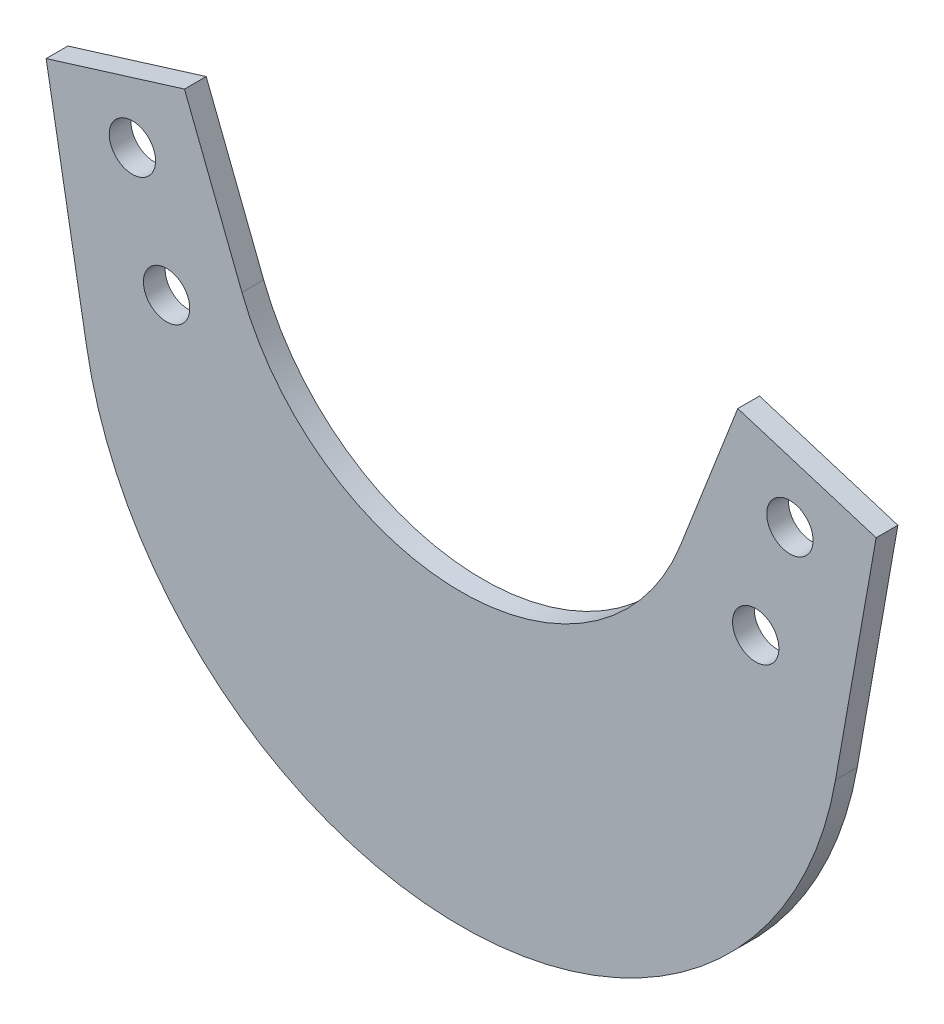
ISO-10303-21;
HEADER;
FILE_DESCRIPTION(('STEP AP214'),'2;1');
FILE_NAME('part.step','',(''),(''),'','','');
FILE_SCHEMA(('AUTOMOTIVE_DESIGN { 1 0 10303 214 1 1 1 1 }'));
ENDSEC;
DATA;
#1=APPLICATION_CONTEXT('core data for automotive mechanical design processes');
#2=APPLICATION_PROTOCOL_DEFINITION('international standard','automotive_design',2000,#1);
#3=PRODUCT_CONTEXT('',#1,'mechanical');
#4=PRODUCT('Part','Part','',(#3));
#5=PRODUCT_RELATED_PRODUCT_CATEGORY('part','',(#4));
#6=PRODUCT_DEFINITION_FORMATION('','',#4);
#7=PRODUCT_DEFINITION_CONTEXT('part definition',#1,'design');
#8=PRODUCT_DEFINITION('design','',#6,#7);
#9=PRODUCT_DEFINITION_SHAPE('','',#8);
#10=(LENGTH_UNIT() NAMED_UNIT(*) SI_UNIT(.MILLI.,.METRE.));
#11=(NAMED_UNIT(*) PLANE_ANGLE_UNIT() SI_UNIT($,.RADIAN.));
#12=(NAMED_UNIT(*) SI_UNIT($,.STERADIAN.) SOLID_ANGLE_UNIT());
#13=UNCERTAINTY_MEASURE_WITH_UNIT(LENGTH_MEASURE(1.E-05),#10,'distance_accuracy_value','');
#14=(GEOMETRIC_REPRESENTATION_CONTEXT(3) GLOBAL_UNCERTAINTY_ASSIGNED_CONTEXT((#13)) GLOBAL_UNIT_ASSIGNED_CONTEXT((#10,
#11,#12)) REPRESENTATION_CONTEXT('',''));
#15=CARTESIAN_POINT('',(0.,0.,0.));
#16=DIRECTION('',(0.,0.,1.));
#17=DIRECTION('',(1.,0.,0.));
#18=AXIS2_PLACEMENT_3D('',#15,#16,#17);
#19=CARTESIAN_POINT('',(0.,-9.98934813051989,1.5));
#20=DIRECTION('',(0.,0.,-1.));
#21=DIRECTION('',(-1.,0.,0.));
#22=AXIS2_PLACEMENT_3D('',#19,#20,#21);
#23=PLANE('',#22);
#24=CARTESIAN_POINT('',(-20.3447741328273,-8.66515844111932,1.5));
#25=DIRECTION('',(0.,0.,1.));
#26=DIRECTION('',(-1.,0.,0.));
#27=AXIS2_PLACEMENT_3D('',#24,#25,#26);
#28=CIRCLE('',#27,1.6);
#29=CARTESIAN_POINT('',(-21.9447741328273,-8.66515844111932,1.5));
#30=VERTEX_POINT('',#29);
#31=EDGE_CURVE('E194',#30,#30,#28,.T.);
#32=ORIENTED_EDGE('',*,*,#31,.F.);
#33=EDGE_LOOP('',(#32));
#34=FACE_BOUND('',#33,.T.);
#35=CARTESIAN_POINT('',(22.7056354362289,-1.02144639093708,1.5));
#36=DIRECTION('',(0.,0.,1.));
#37=DIRECTION('',(1.,0.,0.));
#38=AXIS2_PLACEMENT_3D('',#35,#36,#37);
#39=CIRCLE('',#38,1.6);
#40=CARTESIAN_POINT('',(24.3056354362289,-1.02144639093708,1.5));
#41=VERTEX_POINT('',#40);
#42=EDGE_CURVE('E140',#41,#41,#39,.T.);
#43=ORIENTED_EDGE('',*,*,#42,.F.);
#44=EDGE_LOOP('',(#43));
#45=FACE_BOUND('',#44,.T.);
#46=CARTESIAN_POINT('',(0.,-9.98934813051989,1.5));
#47=DIRECTION('',(0.,0.,1.));
#48=DIRECTION('',(-1.,0.,0.));
#49=AXIS2_PLACEMENT_3D('',#46,#47,#48);
#50=CIRCLE('',#49,26.2596890801031);
#51=CARTESIAN_POINT('',(-25.8597429300659,-14.5549769124724,1.5));
#52=VERTEX_POINT('',#51);
#53=CARTESIAN_POINT('',(25.8597429300659,-14.5549769124724,1.5));
#54=VERTEX_POINT('',#53);
#55=EDGE_CURVE('E151',#52,#54,#50,.T.);
#56=ORIENTED_EDGE('',*,*,#55,.T.);
#57=DIRECTION('',(0.173864540742482,0.984769577856874,0.));
#58=VECTOR('',#57,1.);
#59=CARTESIAN_POINT('',(25.8597429300659,-14.5549769124724,1.5));
#60=LINE('',#59,#58);
#61=CARTESIAN_POINT('',(28.6633861192936,1.32487131952806,1.5));
#62=VERTEX_POINT('',#61);
#63=EDGE_CURVE('E99',#54,#62,#60,.T.);
#64=ORIENTED_EDGE('',*,*,#63,.T.);
#65=DIRECTION('',(-0.955464006272779,0.295107662925195,0.));
#66=VECTOR('',#65,1.);
#67=CARTESIAN_POINT('',(19.1087460565658,4.27594794878001,1.5));
#68=LINE('',#67,#66);
#69=CARTESIAN_POINT('',(19.1087460565658,4.27594794878001,1.5));
#70=VERTEX_POINT('',#69);
#71=EDGE_CURVE('E166',#62,#70,#68,.T.);
#72=ORIENTED_EDGE('',*,*,#71,.T.);
#73=DIRECTION('',(-0.363351040746457,-0.931652307026858,0.));
#74=VECTOR('',#73,1.);
#75=CARTESIAN_POINT('',(19.1087460565658,4.27594794878001,1.5));
#76=LINE('',#75,#74);
#77=CARTESIAN_POINT('',(15.1384530042422,-5.90410458160777,1.5));
#78=VERTEX_POINT('',#77);
#79=EDGE_CURVE('E179',#70,#78,#76,.T.);
#80=ORIENTED_EDGE('',*,*,#79,.T.);
#81=CARTESIAN_POINT('',(0.,0.,1.5));
#82=DIRECTION('',(0.,0.,-1.));
#83=DIRECTION('',(-1.,0.,0.));
#84=AXIS2_PLACEMENT_3D('',#81,#82,#83);
#85=CIRCLE('',#84,16.249037210623);
#86=CARTESIAN_POINT('',(-15.1384530042422,-5.90410458160778,1.5));
#87=VERTEX_POINT('',#86);
#88=EDGE_CURVE('E118',#78,#87,#85,.T.);
#89=ORIENTED_EDGE('',*,*,#88,.T.);
#90=DIRECTION('',(-0.363351040746457,0.931652307026858,0.));
#91=VECTOR('',#90,1.);
#92=CARTESIAN_POINT('',(-19.1087460565658,4.27594794878001,1.5));
#93=LINE('',#92,#91);
#94=CARTESIAN_POINT('',(-19.1087460565658,4.27594794878001,1.5));
#95=VERTEX_POINT('',#94);
#96=EDGE_CURVE('E112',#87,#95,#93,.T.);
#97=ORIENTED_EDGE('',*,*,#96,.T.);
#98=DIRECTION('',(-0.955464006272779,-0.295107662925195,0.));
#99=VECTOR('',#98,1.);
#100=CARTESIAN_POINT('',(-19.1087460565658,4.27594794878001,1.5));
#101=LINE('',#100,#99);
#102=CARTESIAN_POINT('',(-28.6633861192936,1.32487131952806,1.5));
#103=VERTEX_POINT('',#102);
#104=EDGE_CURVE('E116',#95,#103,#101,.T.);
#105=ORIENTED_EDGE('',*,*,#104,.T.);
#106=DIRECTION('',(0.173864540742482,-0.984769577856874,0.));
#107=VECTOR('',#106,1.);
#108=CARTESIAN_POINT('',(-25.8597429300659,-14.5549769124724,1.5));
#109=LINE('',#108,#107);
#110=EDGE_CURVE('E56',#103,#52,#109,.T.);
#111=ORIENTED_EDGE('',*,*,#110,.T.);
#112=EDGE_LOOP('',(#56,#64,#72,#80,#89,#97,#105,#111));
#113=FACE_BOUND('',#112,.T.);
#114=CARTESIAN_POINT('',(20.3447741328273,-8.66515844111932,1.5));
#115=DIRECTION('',(0.,0.,1.));
#116=DIRECTION('',(1.,0.,0.));
#117=AXIS2_PLACEMENT_3D('',#114,#115,#116);
#118=CIRCLE('',#117,1.6);
#119=CARTESIAN_POINT('',(21.9447741328274,-8.66515844111932,1.5));
#120=VERTEX_POINT('',#119);
#121=EDGE_CURVE('E188',#120,#120,#118,.T.);
#122=ORIENTED_EDGE('',*,*,#121,.F.);
#123=EDGE_LOOP('',(#122));
#124=FACE_BOUND('',#123,.T.);
#125=CARTESIAN_POINT('',(-22.7056354362289,-1.02144639093708,1.5));
#126=DIRECTION('',(0.,0.,1.));
#127=DIRECTION('',(-1.,0.,0.));
#128=AXIS2_PLACEMENT_3D('',#125,#126,#127);
#129=CIRCLE('',#128,1.59999999999999);
#130=CARTESIAN_POINT('',(-24.3056354362289,-1.02144639093708,1.5));
#131=VERTEX_POINT('',#130);
#132=EDGE_CURVE('E200',#131,#131,#129,.T.);
#133=ORIENTED_EDGE('',*,*,#132,.F.);
#134=EDGE_LOOP('',(#133));
#135=FACE_BOUND('',#134,.T.);
#136=ADVANCED_FACE('F39',(#34,#45,#113,#124,#135),#23,.F.);
#137=CARTESIAN_POINT('',(0.,-9.98934813051989,0.));
#138=DIRECTION('',(0.,0.,-1.));
#139=DIRECTION('',(-1.,0.,0.));
#140=AXIS2_PLACEMENT_3D('',#137,#138,#139);
#141=PLANE('',#140);
#142=CARTESIAN_POINT('',(-20.3447741328273,-8.66515844111932,0.));
#143=DIRECTION('',(0.,0.,1.));
#144=DIRECTION('',(-1.,0.,0.));
#145=AXIS2_PLACEMENT_3D('',#142,#143,#144);
#146=CIRCLE('',#145,1.6);
#147=CARTESIAN_POINT('',(-21.9447741328273,-8.66515844111932,0.));
#148=VERTEX_POINT('',#147);
#149=EDGE_CURVE('E197',#148,#148,#146,.T.);
#150=ORIENTED_EDGE('',*,*,#149,.T.);
#151=EDGE_LOOP('',(#150));
#152=FACE_BOUND('',#151,.T.);
#153=CARTESIAN_POINT('',(22.7056354362289,-1.02144639093708,0.));
#154=DIRECTION('',(0.,0.,1.));
#155=DIRECTION('',(1.,0.,0.));
#156=AXIS2_PLACEMENT_3D('',#153,#154,#155);
#157=CIRCLE('',#156,1.6);
#158=CARTESIAN_POINT('',(24.3056354362289,-1.02144639093708,0.));
#159=VERTEX_POINT('',#158);
#160=EDGE_CURVE('E185',#159,#159,#157,.T.);
#161=ORIENTED_EDGE('',*,*,#160,.T.);
#162=EDGE_LOOP('',(#161));
#163=FACE_BOUND('',#162,.T.);
#164=CARTESIAN_POINT('',(0.,-9.98934813051989,0.));
#165=DIRECTION('',(0.,0.,1.));
#166=DIRECTION('',(-1.,0.,0.));
#167=AXIS2_PLACEMENT_3D('',#164,#165,#166);
#168=CIRCLE('',#167,26.2596890801031);
#169=CARTESIAN_POINT('',(-25.8597429300659,-14.5549769124724,0.));
#170=VERTEX_POINT('',#169);
#171=CARTESIAN_POINT('',(25.8597429300659,-14.5549769124724,0.));
#172=VERTEX_POINT('',#171);
#173=EDGE_CURVE('E136',#170,#172,#168,.T.);
#174=ORIENTED_EDGE('',*,*,#173,.F.);
#175=DIRECTION('',(0.173864540742482,-0.984769577856874,0.));
#176=VECTOR('',#175,1.);
#177=CARTESIAN_POINT('',(-25.8597429300659,-14.5549769124724,0.));
#178=LINE('',#177,#176);
#179=CARTESIAN_POINT('',(-28.6633861192936,1.32487131952806,0.));
#180=VERTEX_POINT('',#179);
#181=EDGE_CURVE('E91',#180,#170,#178,.T.);
#182=ORIENTED_EDGE('',*,*,#181,.F.);
#183=DIRECTION('',(-0.955464006272779,-0.295107662925195,0.));
#184=VECTOR('',#183,1.);
#185=CARTESIAN_POINT('',(-19.1087460565658,4.27594794878001,0.));
#186=LINE('',#185,#184);
#187=CARTESIAN_POINT('',(-19.1087460565658,4.27594794878001,0.));
#188=VERTEX_POINT('',#187);
#189=EDGE_CURVE('E85',#188,#180,#186,.T.);
#190=ORIENTED_EDGE('',*,*,#189,.F.);
#191=DIRECTION('',(-0.363351040746457,0.931652307026858,0.));
#192=VECTOR('',#191,1.);
#193=CARTESIAN_POINT('',(-19.1087460565658,4.27594794878001,0.));
#194=LINE('',#193,#192);
#195=CARTESIAN_POINT('',(-15.1384530042422,-5.90410458160778,0.));
#196=VERTEX_POINT('',#195);
#197=EDGE_CURVE('E126',#196,#188,#194,.T.);
#198=ORIENTED_EDGE('',*,*,#197,.F.);
#199=CARTESIAN_POINT('',(0.,0.,0.));
#200=DIRECTION('',(0.,0.,-1.));
#201=DIRECTION('',(-1.,0.,0.));
#202=AXIS2_PLACEMENT_3D('',#199,#200,#201);
#203=CIRCLE('',#202,16.249037210623);
#204=CARTESIAN_POINT('',(15.1384530042422,-5.90410458160777,0.));
#205=VERTEX_POINT('',#204);
#206=EDGE_CURVE('E146',#205,#196,#203,.T.);
#207=ORIENTED_EDGE('',*,*,#206,.F.);
#208=DIRECTION('',(-0.363351040746457,-0.931652307026858,0.));
#209=VECTOR('',#208,1.);
#210=CARTESIAN_POINT('',(19.1087460565658,4.27594794878001,0.));
#211=LINE('',#210,#209);
#212=CARTESIAN_POINT('',(19.1087460565658,4.27594794878001,0.));
#213=VERTEX_POINT('',#212);
#214=EDGE_CURVE('E144',#213,#205,#211,.T.);
#215=ORIENTED_EDGE('',*,*,#214,.F.);
#216=DIRECTION('',(-0.955464006272779,0.295107662925195,0.));
#217=VECTOR('',#216,1.);
#218=CARTESIAN_POINT('',(19.1087460565658,4.27594794878001,0.));
#219=LINE('',#218,#217);
#220=CARTESIAN_POINT('',(28.6633861192936,1.32487131952806,0.));
#221=VERTEX_POINT('',#220);
#222=EDGE_CURVE('E142',#221,#213,#219,.T.);
#223=ORIENTED_EDGE('',*,*,#222,.F.);
#224=DIRECTION('',(0.173864540742482,0.984769577856874,0.));
#225=VECTOR('',#224,1.);
#226=CARTESIAN_POINT('',(25.8597429300659,-14.5549769124724,0.));
#227=LINE('',#226,#225);
#228=EDGE_CURVE('E139',#172,#221,#227,.T.);
#229=ORIENTED_EDGE('',*,*,#228,.F.);
#230=EDGE_LOOP('',(#174,#182,#190,#198,#207,#215,#223,#229));
#231=FACE_BOUND('',#230,.T.);
#232=CARTESIAN_POINT('',(20.3447741328273,-8.66515844111932,0.));
#233=DIRECTION('',(0.,0.,1.));
#234=DIRECTION('',(1.,0.,0.));
#235=AXIS2_PLACEMENT_3D('',#232,#233,#234);
#236=CIRCLE('',#235,1.6);
#237=CARTESIAN_POINT('',(21.9447741328274,-8.66515844111932,0.));
#238=VERTEX_POINT('',#237);
#239=EDGE_CURVE('E191',#238,#238,#236,.T.);
#240=ORIENTED_EDGE('',*,*,#239,.T.);
#241=EDGE_LOOP('',(#240));
#242=FACE_BOUND('',#241,.T.);
#243=CARTESIAN_POINT('',(-22.7056354362289,-1.02144639093708,0.));
#244=DIRECTION('',(0.,0.,1.));
#245=DIRECTION('',(-1.,0.,0.));
#246=AXIS2_PLACEMENT_3D('',#243,#244,#245);
#247=CIRCLE('',#246,1.59999999999999);
#248=CARTESIAN_POINT('',(-24.3056354362289,-1.02144639093708,0.));
#249=VERTEX_POINT('',#248);
#250=EDGE_CURVE('E203',#249,#249,#247,.T.);
#251=ORIENTED_EDGE('',*,*,#250,.T.);
#252=EDGE_LOOP('',(#251));
#253=FACE_BOUND('',#252,.T.);
#254=ADVANCED_FACE('F170',(#152,#163,#231,#242,#253),#141,.T.);
#255=CARTESIAN_POINT('',(0.,-9.98934813051989,1.5));
#256=DIRECTION('',(0.,0.,-1.));
#257=DIRECTION('',(-1.,0.,0.));
#258=AXIS2_PLACEMENT_3D('',#255,#256,#257);
#259=CYLINDRICAL_SURFACE('',#258,26.2596890801031);
#260=ORIENTED_EDGE('',*,*,#173,.T.);
#261=DIRECTION('',(0.,0.,-1.));
#262=VECTOR('',#261,1.);
#263=CARTESIAN_POINT('',(25.8597429300659,-14.5549769124724,1.5));
#264=LINE('',#263,#262);
#265=EDGE_CURVE('E11',#54,#172,#264,.T.);
#266=ORIENTED_EDGE('',*,*,#265,.F.);
#267=ORIENTED_EDGE('',*,*,#55,.F.);
#268=DIRECTION('',(0.,0.,-1.));
#269=VECTOR('',#268,1.);
#270=CARTESIAN_POINT('',(-25.8597429300659,-14.5549769124724,1.5));
#271=LINE('',#270,#269);
#272=EDGE_CURVE('E132',#52,#170,#271,.T.);
#273=ORIENTED_EDGE('',*,*,#272,.T.);
#274=EDGE_LOOP('',(#260,#266,#267,#273));
#275=FACE_BOUND('',#274,.T.);
#276=ADVANCED_FACE('F41',(#275),#259,.T.);
#277=CARTESIAN_POINT('',(25.8597429300659,-14.5549769124724,1.5));
#278=DIRECTION('',(-0.984769577856874,0.173864540742482,0.));
#279=DIRECTION('',(-0.173864540742482,-0.984769577856874,0.));
#280=AXIS2_PLACEMENT_3D('',#277,#278,#279);
#281=PLANE('',#280);
#282=ORIENTED_EDGE('',*,*,#228,.T.);
#283=DIRECTION('',(0.,0.,-1.));
#284=VECTOR('',#283,1.);
#285=CARTESIAN_POINT('',(28.6633861192936,1.32487131952806,1.5));
#286=LINE('',#285,#284);
#287=EDGE_CURVE('E48',#62,#221,#286,.T.);
#288=ORIENTED_EDGE('',*,*,#287,.F.);
#289=ORIENTED_EDGE('',*,*,#63,.F.);
#290=ORIENTED_EDGE('',*,*,#265,.T.);
#291=EDGE_LOOP('',(#282,#288,#289,#290));
#292=FACE_BOUND('',#291,.T.);
#293=ADVANCED_FACE('F238',(#292),#281,.F.);
#294=CARTESIAN_POINT('',(19.1087460565658,4.27594794878001,1.5));
#295=DIRECTION('',(-0.295107662925195,-0.955464006272779,0.));
#296=DIRECTION('',(0.955464006272779,-0.295107662925195,0.));
#297=AXIS2_PLACEMENT_3D('',#294,#295,#296);
#298=PLANE('',#297);
#299=ORIENTED_EDGE('',*,*,#222,.T.);
#300=DIRECTION('',(0.,0.,-1.));
#301=VECTOR('',#300,1.);
#302=CARTESIAN_POINT('',(19.1087460565658,4.27594794878001,1.5));
#303=LINE('',#302,#301);
#304=EDGE_CURVE('E158',#70,#213,#303,.T.);
#305=ORIENTED_EDGE('',*,*,#304,.F.);
#306=ORIENTED_EDGE('',*,*,#71,.F.);
#307=ORIENTED_EDGE('',*,*,#287,.T.);
#308=EDGE_LOOP('',(#299,#305,#306,#307));
#309=FACE_BOUND('',#308,.T.);
#310=ADVANCED_FACE('F164',(#309),#298,.F.);
#311=CARTESIAN_POINT('',(19.1087460565658,4.27594794878001,1.5));
#312=DIRECTION('',(0.931652307026858,-0.363351040746457,0.));
#313=DIRECTION('',(0.363351040746457,0.931652307026858,0.));
#314=AXIS2_PLACEMENT_3D('',#311,#312,#313);
#315=PLANE('',#314);
#316=ORIENTED_EDGE('',*,*,#214,.T.);
#317=DIRECTION('',(0.,0.,-1.));
#318=VECTOR('',#317,1.);
#319=CARTESIAN_POINT('',(15.1384530042422,-5.90410458160777,1.5));
#320=LINE('',#319,#318);
#321=EDGE_CURVE('E155',#78,#205,#320,.T.);
#322=ORIENTED_EDGE('',*,*,#321,.F.);
#323=ORIENTED_EDGE('',*,*,#79,.F.);
#324=ORIENTED_EDGE('',*,*,#304,.T.);
#325=EDGE_LOOP('',(#316,#322,#323,#324));
#326=FACE_BOUND('',#325,.T.);
#327=ADVANCED_FACE('F175',(#326),#315,.F.);
#328=CARTESIAN_POINT('',(0.,0.,1.5));
#329=DIRECTION('',(0.,0.,-1.));
#330=DIRECTION('',(-1.,0.,0.));
#331=AXIS2_PLACEMENT_3D('',#328,#329,#330);
#332=CYLINDRICAL_SURFACE('',#331,16.249037210623);
#333=ORIENTED_EDGE('',*,*,#206,.T.);
#334=DIRECTION('',(0.,0.,-1.));
#335=VECTOR('',#334,1.);
#336=CARTESIAN_POINT('',(-15.1384530042422,-5.90410458160778,1.5));
#337=LINE('',#336,#335);
#338=EDGE_CURVE('E127',#87,#196,#337,.T.);
#339=ORIENTED_EDGE('',*,*,#338,.F.);
#340=ORIENTED_EDGE('',*,*,#88,.F.);
#341=ORIENTED_EDGE('',*,*,#321,.T.);
#342=EDGE_LOOP('',(#333,#339,#340,#341));
#343=FACE_BOUND('',#342,.T.);
#344=ADVANCED_FACE('F178',(#343),#332,.F.);
#345=CARTESIAN_POINT('',(-19.1087460565658,4.27594794878001,1.5));
#346=DIRECTION('',(-0.931652307026858,-0.363351040746457,0.));
#347=DIRECTION('',(0.363351040746457,-0.931652307026858,0.));
#348=AXIS2_PLACEMENT_3D('',#345,#346,#347);
#349=PLANE('',#348);
#350=ORIENTED_EDGE('',*,*,#197,.T.);
#351=DIRECTION('',(0.,0.,-1.));
#352=VECTOR('',#351,1.);
#353=CARTESIAN_POINT('',(-19.1087460565658,4.27594794878001,1.5));
#354=LINE('',#353,#352);
#355=EDGE_CURVE('E123',#95,#188,#354,.T.);
#356=ORIENTED_EDGE('',*,*,#355,.F.);
#357=ORIENTED_EDGE('',*,*,#96,.F.);
#358=ORIENTED_EDGE('',*,*,#338,.T.);
#359=EDGE_LOOP('',(#350,#356,#357,#358));
#360=FACE_BOUND('',#359,.T.);
#361=ADVANCED_FACE('F124',(#360),#349,.F.);
#362=CARTESIAN_POINT('',(-19.1087460565658,4.27594794878001,1.5));
#363=DIRECTION('',(0.295107662925195,-0.955464006272779,0.));
#364=DIRECTION('',(0.955464006272779,0.295107662925195,0.));
#365=AXIS2_PLACEMENT_3D('',#362,#363,#364);
#366=PLANE('',#365);
#367=ORIENTED_EDGE('',*,*,#189,.T.);
#368=DIRECTION('',(0.,0.,-1.));
#369=VECTOR('',#368,1.);
#370=CARTESIAN_POINT('',(-28.6633861192936,1.32487131952806,1.5));
#371=LINE('',#370,#369);
#372=EDGE_CURVE('E128',#103,#180,#371,.T.);
#373=ORIENTED_EDGE('',*,*,#372,.F.);
#374=ORIENTED_EDGE('',*,*,#104,.F.);
#375=ORIENTED_EDGE('',*,*,#355,.T.);
#376=EDGE_LOOP('',(#367,#373,#374,#375));
#377=FACE_BOUND('',#376,.T.);
#378=ADVANCED_FACE('F130',(#377),#366,.F.);
#379=CARTESIAN_POINT('',(-25.8597429300659,-14.5549769124724,1.5));
#380=DIRECTION('',(0.984769577856874,0.173864540742482,0.));
#381=DIRECTION('',(-0.173864540742482,0.984769577856874,0.));
#382=AXIS2_PLACEMENT_3D('',#379,#380,#381);
#383=PLANE('',#382);
#384=ORIENTED_EDGE('',*,*,#181,.T.);
#385=ORIENTED_EDGE('',*,*,#272,.F.);
#386=ORIENTED_EDGE('',*,*,#110,.F.);
#387=ORIENTED_EDGE('',*,*,#372,.T.);
#388=EDGE_LOOP('',(#384,#385,#386,#387));
#389=FACE_BOUND('',#388,.T.);
#390=ADVANCED_FACE('F226',(#389),#383,.F.);
#391=CARTESIAN_POINT('',(22.7056354362289,-1.02144639093708,1.5));
#392=DIRECTION('',(0.,0.,-1.));
#393=DIRECTION('',(-1.,0.,0.));
#394=AXIS2_PLACEMENT_3D('',#391,#392,#393);
#395=CYLINDRICAL_SURFACE('',#394,1.6);
#396=ORIENTED_EDGE('',*,*,#42,.T.);
#397=EDGE_LOOP('',(#396));
#398=FACE_BOUND('',#397,.T.);
#399=ORIENTED_EDGE('',*,*,#160,.F.);
#400=EDGE_LOOP('',(#399));
#401=FACE_BOUND('',#400,.T.);
#402=ADVANCED_FACE('F223',(#398,#401),#395,.F.);
#403=CARTESIAN_POINT('',(20.3447741328273,-8.66515844111932,1.5));
#404=DIRECTION('',(0.,0.,-1.));
#405=DIRECTION('',(-1.,0.,0.));
#406=AXIS2_PLACEMENT_3D('',#403,#404,#405);
#407=CYLINDRICAL_SURFACE('',#406,1.6);
#408=ORIENTED_EDGE('',*,*,#121,.T.);
#409=EDGE_LOOP('',(#408));
#410=FACE_BOUND('',#409,.T.);
#411=ORIENTED_EDGE('',*,*,#239,.F.);
#412=EDGE_LOOP('',(#411));
#413=FACE_BOUND('',#412,.T.);
#414=ADVANCED_FACE('F302',(#410,#413),#407,.F.);
#415=CARTESIAN_POINT('',(-20.3447741328273,-8.66515844111932,1.5));
#416=DIRECTION('',(0.,0.,-1.));
#417=DIRECTION('',(-1.,0.,0.));
#418=AXIS2_PLACEMENT_3D('',#415,#416,#417);
#419=CYLINDRICAL_SURFACE('',#418,1.6);
#420=ORIENTED_EDGE('',*,*,#31,.T.);
#421=EDGE_LOOP('',(#420));
#422=FACE_BOUND('',#421,.T.);
#423=ORIENTED_EDGE('',*,*,#149,.F.);
#424=EDGE_LOOP('',(#423));
#425=FACE_BOUND('',#424,.T.);
#426=ADVANCED_FACE('F310',(#422,#425),#419,.F.);
#427=CARTESIAN_POINT('',(-22.7056354362289,-1.02144639093708,1.5));
#428=DIRECTION('',(0.,0.,-1.));
#429=DIRECTION('',(-1.,0.,0.));
#430=AXIS2_PLACEMENT_3D('',#427,#428,#429);
#431=CYLINDRICAL_SURFACE('',#430,1.59999999999999);
#432=ORIENTED_EDGE('',*,*,#132,.T.);
#433=EDGE_LOOP('',(#432));
#434=FACE_BOUND('',#433,.T.);
#435=ORIENTED_EDGE('',*,*,#250,.F.);
#436=EDGE_LOOP('',(#435));
#437=FACE_BOUND('',#436,.T.);
#438=ADVANCED_FACE('F209',(#434,#437),#431,.F.);
#439=CLOSED_SHELL('',(#136,#254,#276,#293,#310,#327,#344,#361,#378,#390,#402,#414,#426,#438));
#440=MANIFOLD_SOLID_BREP('B2',#439);
#441=ADVANCED_BREP_SHAPE_REPRESENTATION('',(#18,#440),#14);
#442=SHAPE_DEFINITION_REPRESENTATION(#9,#441);
ENDSEC;
END-ISO-10303-21;
